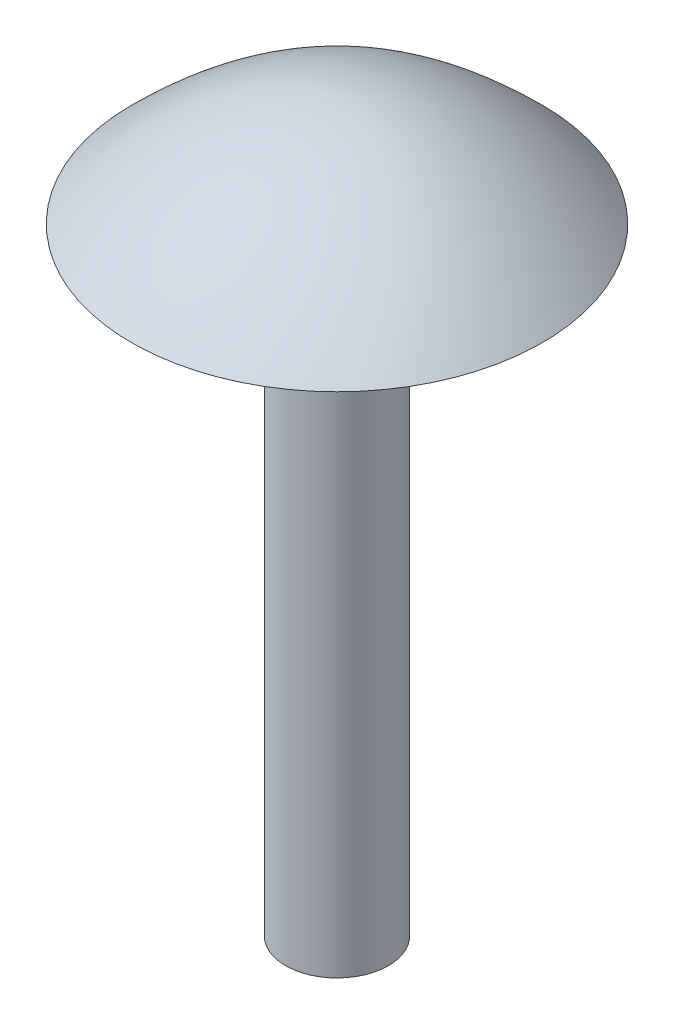
ISO-10303-21;
HEADER;
FILE_DESCRIPTION(('STEP AP214'),'2;1');
FILE_NAME('part.step','',(''),(''),'','','');
FILE_SCHEMA(('AUTOMOTIVE_DESIGN { 1 0 10303 214 1 1 1 1 }'));
ENDSEC;
DATA;
#1=APPLICATION_CONTEXT('core data for automotive mechanical design processes');
#2=APPLICATION_PROTOCOL_DEFINITION('international standard','automotive_design',2000,#1);
#3=PRODUCT_CONTEXT('',#1,'mechanical');
#4=PRODUCT('Part','Part','',(#3));
#5=PRODUCT_RELATED_PRODUCT_CATEGORY('part','',(#4));
#6=PRODUCT_DEFINITION_FORMATION('','',#4);
#7=PRODUCT_DEFINITION_CONTEXT('part definition',#1,'design');
#8=PRODUCT_DEFINITION('design','',#6,#7);
#9=PRODUCT_DEFINITION_SHAPE('','',#8);
#10=(LENGTH_UNIT() NAMED_UNIT(*) SI_UNIT(.MILLI.,.METRE.));
#11=(NAMED_UNIT(*) PLANE_ANGLE_UNIT() SI_UNIT($,.RADIAN.));
#12=(NAMED_UNIT(*) SI_UNIT($,.STERADIAN.) SOLID_ANGLE_UNIT());
#13=UNCERTAINTY_MEASURE_WITH_UNIT(LENGTH_MEASURE(1.E-05),#10,'distance_accuracy_value','');
#14=(GEOMETRIC_REPRESENTATION_CONTEXT(3) GLOBAL_UNCERTAINTY_ASSIGNED_CONTEXT((#13)) GLOBAL_UNIT_ASSIGNED_CONTEXT((#10,
#11,#12)) REPRESENTATION_CONTEXT('',''));
#15=CARTESIAN_POINT('',(0.,0.,0.));
#16=DIRECTION('',(0.,0.,1.));
#17=DIRECTION('',(1.,0.,0.));
#18=AXIS2_PLACEMENT_3D('',#15,#16,#17);
#19=CARTESIAN_POINT('',(0.,0.,0.));
#20=DIRECTION('',(0.,1.,0.));
#21=DIRECTION('',(0.,0.,1.));
#22=AXIS2_PLACEMENT_3D('',#19,#20,#21);
#23=PLANE('',#22);
#24=CARTESIAN_POINT('',(0.5,0.,0.));
#25=DIRECTION('',(0.,-1.,0.));
#26=DIRECTION('',(0.,0.,-1.));
#27=AXIS2_PLACEMENT_3D('',#24,#25,#26);
#28=CIRCLE('',#27,0.5);
#29=CARTESIAN_POINT('',(0.5,0.,-0.5));
#30=VERTEX_POINT('',#29);
#31=EDGE_CURVE('E74',#30,#30,#28,.T.);
#32=ORIENTED_EDGE('',*,*,#31,.T.);
#33=EDGE_LOOP('',(#32));
#34=FACE_BOUND('',#33,.T.);
#35=ADVANCED_FACE('F45',(#34),#23,.F.);
#36=CARTESIAN_POINT('',(0.5,7.,0.));
#37=CARTESIAN_POINT('',(-0.5,7.,0.));
#38=CARTESIAN_POINT('',(-1.5,6.,0.));
#39=B_SPLINE_CURVE_WITH_KNOTS('',2,(#36,#37,#38),.UNSPECIFIED.,.F.,.F.,(3,3),(0.,0.5),.UNSPECIFIED.);
#40=CARTESIAN_POINT('',(0.5,-1.40444363637058,0.));
#41=DIRECTION('',(0.,-1.,0.));
#42=AXIS1_PLACEMENT('',#40,#41);
#43=SURFACE_OF_REVOLUTION('',#39,#42);
#44=CARTESIAN_POINT('',(0.5,6.,0.));
#45=DIRECTION('',(0.,-1.,0.));
#46=DIRECTION('',(0.,0.,-1.));
#47=AXIS2_PLACEMENT_3D('',#44,#45,#46);
#48=CIRCLE('',#47,2.);
#49=CARTESIAN_POINT('',(0.5,6.,-2.));
#50=VERTEX_POINT('',#49);
#51=EDGE_CURVE('E11',#50,#50,#48,.T.);
#52=ORIENTED_EDGE('',*,*,#51,.F.);
#53=EDGE_LOOP('',(#52));
#54=FACE_BOUND('',#53,.T.);
#55=CARTESIAN_POINT('',(0.5,7.,0.));
#56=VERTEX_POINT('',#55);
#57=VERTEX_LOOP('',#56);
#58=FACE_BOUND('',#57,.T.);
#59=ADVANCED_FACE('F55',(#54,#58),#43,.T.);
#60=CARTESIAN_POINT('',(0.,6.,0.));
#61=DIRECTION('',(0.,1.,0.));
#62=DIRECTION('',(0.,0.,1.));
#63=AXIS2_PLACEMENT_3D('',#60,#61,#62);
#64=PLANE('',#63);
#65=CARTESIAN_POINT('',(0.5,6.,0.));
#66=DIRECTION('',(0.,-1.,0.));
#67=DIRECTION('',(0.,0.,-1.));
#68=AXIS2_PLACEMENT_3D('',#65,#66,#67);
#69=CIRCLE('',#68,0.5);
#70=CARTESIAN_POINT('',(0.5,6.,-0.5));
#71=VERTEX_POINT('',#70);
#72=EDGE_CURVE('E52',#71,#71,#69,.T.);
#73=ORIENTED_EDGE('',*,*,#72,.F.);
#74=EDGE_LOOP('',(#73));
#75=FACE_BOUND('',#74,.T.);
#76=ORIENTED_EDGE('',*,*,#51,.T.);
#77=EDGE_LOOP('',(#76));
#78=FACE_BOUND('',#77,.T.);
#79=ADVANCED_FACE('F57',(#75,#78),#64,.F.);
#80=CARTESIAN_POINT('',(0.5,-1.40444363637058,0.));
#81=DIRECTION('',(0.,-1.,0.));
#82=DIRECTION('',(0.,0.,-1.));
#83=AXIS2_PLACEMENT_3D('',#80,#81,#82);
#84=CYLINDRICAL_SURFACE('',#83,0.5);
#85=ORIENTED_EDGE('',*,*,#31,.F.);
#86=EDGE_LOOP('',(#85));
#87=FACE_BOUND('',#86,.T.);
#88=ORIENTED_EDGE('',*,*,#72,.T.);
#89=EDGE_LOOP('',(#88));
#90=FACE_BOUND('',#89,.T.);
#91=ADVANCED_FACE('F63',(#87,#90),#84,.T.);
#92=CLOSED_SHELL('',(#35,#59,#79,#91));
#93=MANIFOLD_SOLID_BREP('B2',#92);
#94=ADVANCED_BREP_SHAPE_REPRESENTATION('',(#18,#93),#14);
#95=SHAPE_DEFINITION_REPRESENTATION(#9,#94);
ENDSEC;
END-ISO-10303-21;
